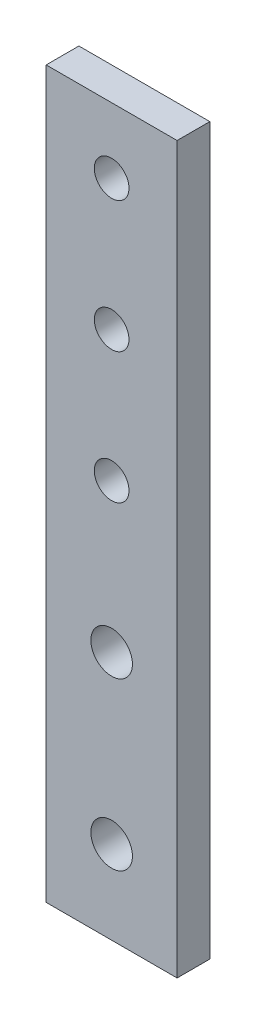
ISO-10303-21;
HEADER;
FILE_DESCRIPTION(('STEP AP214'),'2;1');
FILE_NAME('part.step','',(''),(''),'','','');
FILE_SCHEMA(('AUTOMOTIVE_DESIGN { 1 0 10303 214 1 1 1 1 }'));
ENDSEC;
DATA;
#1=APPLICATION_CONTEXT('core data for automotive mechanical design processes');
#2=APPLICATION_PROTOCOL_DEFINITION('international standard','automotive_design',2000,#1);
#3=PRODUCT_CONTEXT('',#1,'mechanical');
#4=PRODUCT('Part','Part','',(#3));
#5=PRODUCT_RELATED_PRODUCT_CATEGORY('part','',(#4));
#6=PRODUCT_DEFINITION_FORMATION('','',#4);
#7=PRODUCT_DEFINITION_CONTEXT('part definition',#1,'design');
#8=PRODUCT_DEFINITION('design','',#6,#7);
#9=PRODUCT_DEFINITION_SHAPE('','',#8);
#10=(LENGTH_UNIT() NAMED_UNIT(*) SI_UNIT(.MILLI.,.METRE.));
#11=(NAMED_UNIT(*) PLANE_ANGLE_UNIT() SI_UNIT($,.RADIAN.));
#12=(NAMED_UNIT(*) SI_UNIT($,.STERADIAN.) SOLID_ANGLE_UNIT());
#13=UNCERTAINTY_MEASURE_WITH_UNIT(LENGTH_MEASURE(1.E-05),#10,'distance_accuracy_value','');
#14=(GEOMETRIC_REPRESENTATION_CONTEXT(3) GLOBAL_UNCERTAINTY_ASSIGNED_CONTEXT((#13)) GLOBAL_UNIT_ASSIGNED_CONTEXT((#10,
#11,#12)) REPRESENTATION_CONTEXT('',''));
#15=CARTESIAN_POINT('',(0.,0.,0.));
#16=DIRECTION('',(0.,0.,1.));
#17=DIRECTION('',(1.,0.,0.));
#18=AXIS2_PLACEMENT_3D('',#15,#16,#17);
#19=CARTESIAN_POINT('',(-3.48017621145376,75.8330396475771,5.));
#20=DIRECTION('',(1.,0.,0.));
#21=DIRECTION('',(0.,1.,0.));
#22=AXIS2_PLACEMENT_3D('',#19,#20,#21);
#23=PLANE('',#22);
#24=DIRECTION('',(0.,-1.,0.));
#25=VECTOR('',#24,1.);
#26=CARTESIAN_POINT('',(-3.48017621145376,75.8330396475771,0.));
#27=LINE('',#26,#25);
#28=CARTESIAN_POINT('',(-3.48017621145376,75.8330396475771,0.));
#29=VERTEX_POINT('',#28);
#30=CARTESIAN_POINT('',(-3.48017621145374,-34.9669603524229,0.));
#31=VERTEX_POINT('',#30);
#32=EDGE_CURVE('E96',#29,#31,#27,.T.);
#33=ORIENTED_EDGE('',*,*,#32,.T.);
#34=DIRECTION('',(0.,0.,-1.));
#35=VECTOR('',#34,1.);
#36=CARTESIAN_POINT('',(-3.48017621145374,-34.9669603524229,5.));
#37=LINE('',#36,#35);
#38=CARTESIAN_POINT('',(-3.48017621145374,-34.9669603524229,5.));
#39=VERTEX_POINT('',#38);
#40=EDGE_CURVE('E11',#39,#31,#37,.T.);
#41=ORIENTED_EDGE('',*,*,#40,.F.);
#42=DIRECTION('',(0.,-1.,0.));
#43=VECTOR('',#42,1.);
#44=CARTESIAN_POINT('',(-3.48017621145376,75.8330396475771,5.));
#45=LINE('',#44,#43);
#46=CARTESIAN_POINT('',(-3.48017621145376,75.8330396475771,5.));
#47=VERTEX_POINT('',#46);
#48=EDGE_CURVE('E84',#47,#39,#45,.T.);
#49=ORIENTED_EDGE('',*,*,#48,.F.);
#50=DIRECTION('',(0.,0.,-1.));
#51=VECTOR('',#50,1.);
#52=CARTESIAN_POINT('',(-3.48017621145376,75.8330396475771,5.));
#53=LINE('',#52,#51);
#54=EDGE_CURVE('E92',#47,#29,#53,.T.);
#55=ORIENTED_EDGE('',*,*,#54,.T.);
#56=EDGE_LOOP('',(#33,#41,#49,#55));
#57=FACE_BOUND('',#56,.T.);
#58=ADVANCED_FACE('F33',(#57),#23,.F.);
#59=CARTESIAN_POINT('',(-3.48017621145374,-34.9669603524229,5.));
#60=DIRECTION('',(0.,1.,0.));
#61=DIRECTION('',(0.,0.,1.));
#62=AXIS2_PLACEMENT_3D('',#59,#60,#61);
#63=PLANE('',#62);
#64=DIRECTION('',(1.,0.,0.));
#65=VECTOR('',#64,1.);
#66=CARTESIAN_POINT('',(-3.48017621145374,-34.9669603524229,0.));
#67=LINE('',#66,#65);
#68=CARTESIAN_POINT('',(16.5198237885463,-34.9669603524229,0.));
#69=VERTEX_POINT('',#68);
#70=EDGE_CURVE('E88',#31,#69,#67,.T.);
#71=ORIENTED_EDGE('',*,*,#70,.T.);
#72=DIRECTION('',(0.,0.,-1.));
#73=VECTOR('',#72,1.);
#74=CARTESIAN_POINT('',(16.5198237885463,-34.9669603524229,5.));
#75=LINE('',#74,#73);
#76=CARTESIAN_POINT('',(16.5198237885463,-34.9669603524229,5.));
#77=VERTEX_POINT('',#76);
#78=EDGE_CURVE('E41',#77,#69,#75,.T.);
#79=ORIENTED_EDGE('',*,*,#78,.F.);
#80=DIRECTION('',(1.,0.,0.));
#81=VECTOR('',#80,1.);
#82=CARTESIAN_POINT('',(-3.48017621145374,-34.9669603524229,5.));
#83=LINE('',#82,#81);
#84=EDGE_CURVE('E79',#39,#77,#83,.T.);
#85=ORIENTED_EDGE('',*,*,#84,.F.);
#86=ORIENTED_EDGE('',*,*,#40,.T.);
#87=EDGE_LOOP('',(#71,#79,#85,#86));
#88=FACE_BOUND('',#87,.T.);
#89=ADVANCED_FACE('F87',(#88),#63,.F.);
#90=CARTESIAN_POINT('',(16.5198237885462,75.8330396475771,5.));
#91=DIRECTION('',(-1.,0.,0.));
#92=DIRECTION('',(0.,-1.,0.));
#93=AXIS2_PLACEMENT_3D('',#90,#91,#92);
#94=PLANE('',#93);
#95=DIRECTION('',(0.,1.,0.));
#96=VECTOR('',#95,1.);
#97=CARTESIAN_POINT('',(16.5198237885462,75.8330396475771,0.));
#98=LINE('',#97,#96);
#99=CARTESIAN_POINT('',(16.5198237885462,75.8330396475771,0.));
#100=VERTEX_POINT('',#99);
#101=EDGE_CURVE('E66',#69,#100,#98,.T.);
#102=ORIENTED_EDGE('',*,*,#101,.T.);
#103=DIRECTION('',(0.,0.,-1.));
#104=VECTOR('',#103,1.);
#105=CARTESIAN_POINT('',(16.5198237885462,75.8330396475771,5.));
#106=LINE('',#105,#104);
#107=CARTESIAN_POINT('',(16.5198237885462,75.8330396475771,5.));
#108=VERTEX_POINT('',#107);
#109=EDGE_CURVE('E89',#108,#100,#106,.T.);
#110=ORIENTED_EDGE('',*,*,#109,.F.);
#111=DIRECTION('',(0.,1.,0.));
#112=VECTOR('',#111,1.);
#113=CARTESIAN_POINT('',(16.5198237885462,75.8330396475771,5.));
#114=LINE('',#113,#112);
#115=EDGE_CURVE('E82',#77,#108,#114,.T.);
#116=ORIENTED_EDGE('',*,*,#115,.F.);
#117=ORIENTED_EDGE('',*,*,#78,.T.);
#118=EDGE_LOOP('',(#102,#110,#116,#117));
#119=FACE_BOUND('',#118,.T.);
#120=ADVANCED_FACE('F90',(#119),#94,.F.);
#121=CARTESIAN_POINT('',(-3.48017621145376,75.8330396475771,5.));
#122=DIRECTION('',(0.,-1.,0.));
#123=DIRECTION('',(0.,0.,-1.));
#124=AXIS2_PLACEMENT_3D('',#121,#122,#123);
#125=PLANE('',#124);
#126=DIRECTION('',(-1.,0.,0.));
#127=VECTOR('',#126,1.);
#128=CARTESIAN_POINT('',(-3.48017621145376,75.8330396475771,0.));
#129=LINE('',#128,#127);
#130=EDGE_CURVE('E72',#100,#29,#129,.T.);
#131=ORIENTED_EDGE('',*,*,#130,.T.);
#132=ORIENTED_EDGE('',*,*,#54,.F.);
#133=DIRECTION('',(-1.,0.,0.));
#134=VECTOR('',#133,1.);
#135=CARTESIAN_POINT('',(-3.48017621145376,75.8330396475771,5.));
#136=LINE('',#135,#134);
#137=EDGE_CURVE('E49',#108,#47,#136,.T.);
#138=ORIENTED_EDGE('',*,*,#137,.F.);
#139=ORIENTED_EDGE('',*,*,#109,.T.);
#140=EDGE_LOOP('',(#131,#132,#138,#139));
#141=FACE_BOUND('',#140,.T.);
#142=ADVANCED_FACE('F104',(#141),#125,.F.);
#143=CARTESIAN_POINT('',(0.,0.,5.));
#144=DIRECTION('',(0.,0.,1.));
#145=DIRECTION('',(1.,0.,0.));
#146=AXIS2_PLACEMENT_3D('',#143,#144,#145);
#147=PLANE('',#146);
#148=CARTESIAN_POINT('',(6.51982378854626,3.13303964757708,5.));
#149=DIRECTION('',(0.,0.,1.));
#150=DIRECTION('',(1.,0.,0.));
#151=AXIS2_PLACEMENT_3D('',#148,#149,#150);
#152=CIRCLE('',#151,3.175);
#153=CARTESIAN_POINT('',(9.69482378854625,3.13303964757708,5.));
#154=VERTEX_POINT('',#153);
#155=EDGE_CURVE('E136',#154,#154,#152,.T.);
#156=ORIENTED_EDGE('',*,*,#155,.F.);
#157=EDGE_LOOP('',(#156));
#158=FACE_BOUND('',#157,.T.);
#159=CARTESIAN_POINT('',(6.51982378854626,-22.2669603524229,5.));
#160=DIRECTION('',(0.,0.,1.));
#161=DIRECTION('',(1.,0.,0.));
#162=AXIS2_PLACEMENT_3D('',#159,#160,#161);
#163=CIRCLE('',#162,3.175);
#164=CARTESIAN_POINT('',(9.69482378854625,-22.2669603524229,5.));
#165=VERTEX_POINT('',#164);
#166=EDGE_CURVE('E130',#165,#165,#163,.T.);
#167=ORIENTED_EDGE('',*,*,#166,.F.);
#168=EDGE_LOOP('',(#167));
#169=FACE_BOUND('',#168,.T.);
#170=CARTESIAN_POINT('',(6.51982378854624,65.8330396475771,5.));
#171=DIRECTION('',(0.,0.,1.));
#172=DIRECTION('',(1.,0.,0.));
#173=AXIS2_PLACEMENT_3D('',#170,#171,#172);
#174=CIRCLE('',#173,2.65);
#175=CARTESIAN_POINT('',(9.16982378854624,65.8330396475771,5.));
#176=VERTEX_POINT('',#175);
#177=EDGE_CURVE('E124',#176,#176,#174,.T.);
#178=ORIENTED_EDGE('',*,*,#177,.F.);
#179=EDGE_LOOP('',(#178));
#180=FACE_BOUND('',#179,.T.);
#181=CARTESIAN_POINT('',(6.51982378854625,45.8330396475771,5.));
#182=DIRECTION('',(0.,0.,1.));
#183=DIRECTION('',(1.,0.,0.));
#184=AXIS2_PLACEMENT_3D('',#181,#182,#183);
#185=CIRCLE('',#184,2.65);
#186=CARTESIAN_POINT('',(9.16982378854625,45.8330396475771,5.));
#187=VERTEX_POINT('',#186);
#188=EDGE_CURVE('E118',#187,#187,#185,.T.);
#189=ORIENTED_EDGE('',*,*,#188,.F.);
#190=EDGE_LOOP('',(#189));
#191=FACE_BOUND('',#190,.T.);
#192=CARTESIAN_POINT('',(6.51982378854625,25.8330396475771,5.));
#193=DIRECTION('',(0.,0.,1.));
#194=DIRECTION('',(1.,0.,0.));
#195=AXIS2_PLACEMENT_3D('',#192,#193,#194);
#196=CIRCLE('',#195,2.65);
#197=CARTESIAN_POINT('',(9.16982378854625,25.8330396475771,5.));
#198=VERTEX_POINT('',#197);
#199=EDGE_CURVE('E112',#198,#198,#196,.T.);
#200=ORIENTED_EDGE('',*,*,#199,.F.);
#201=EDGE_LOOP('',(#200));
#202=FACE_BOUND('',#201,.T.);
#203=ORIENTED_EDGE('',*,*,#48,.T.);
#204=ORIENTED_EDGE('',*,*,#84,.T.);
#205=ORIENTED_EDGE('',*,*,#115,.T.);
#206=ORIENTED_EDGE('',*,*,#137,.T.);
#207=EDGE_LOOP('',(#203,#204,#205,#206));
#208=FACE_BOUND('',#207,.T.);
#209=ADVANCED_FACE('F80',(#158,#169,#180,#191,#202,#208),#147,.T.);
#210=CARTESIAN_POINT('',(0.,0.,0.));
#211=DIRECTION('',(0.,0.,1.));
#212=DIRECTION('',(1.,0.,0.));
#213=AXIS2_PLACEMENT_3D('',#210,#211,#212);
#214=PLANE('',#213);
#215=CARTESIAN_POINT('',(6.51982378854626,3.13303964757708,0.));
#216=DIRECTION('',(0.,0.,1.));
#217=DIRECTION('',(1.,0.,0.));
#218=AXIS2_PLACEMENT_3D('',#215,#216,#217);
#219=CIRCLE('',#218,3.175);
#220=CARTESIAN_POINT('',(9.69482378854625,3.13303964757708,0.));
#221=VERTEX_POINT('',#220);
#222=EDGE_CURVE('E133',#221,#221,#219,.T.);
#223=ORIENTED_EDGE('',*,*,#222,.T.);
#224=EDGE_LOOP('',(#223));
#225=FACE_BOUND('',#224,.T.);
#226=CARTESIAN_POINT('',(6.51982378854626,-22.2669603524229,0.));
#227=DIRECTION('',(0.,0.,1.));
#228=DIRECTION('',(1.,0.,0.));
#229=AXIS2_PLACEMENT_3D('',#226,#227,#228);
#230=CIRCLE('',#229,3.175);
#231=CARTESIAN_POINT('',(9.69482378854625,-22.2669603524229,0.));
#232=VERTEX_POINT('',#231);
#233=EDGE_CURVE('E127',#232,#232,#230,.T.);
#234=ORIENTED_EDGE('',*,*,#233,.T.);
#235=EDGE_LOOP('',(#234));
#236=FACE_BOUND('',#235,.T.);
#237=CARTESIAN_POINT('',(6.51982378854624,65.8330396475771,0.));
#238=DIRECTION('',(0.,0.,1.));
#239=DIRECTION('',(1.,0.,0.));
#240=AXIS2_PLACEMENT_3D('',#237,#238,#239);
#241=CIRCLE('',#240,2.65);
#242=CARTESIAN_POINT('',(9.16982378854624,65.8330396475771,0.));
#243=VERTEX_POINT('',#242);
#244=EDGE_CURVE('E121',#243,#243,#241,.T.);
#245=ORIENTED_EDGE('',*,*,#244,.T.);
#246=EDGE_LOOP('',(#245));
#247=FACE_BOUND('',#246,.T.);
#248=CARTESIAN_POINT('',(6.51982378854625,45.8330396475771,0.));
#249=DIRECTION('',(0.,0.,1.));
#250=DIRECTION('',(1.,0.,0.));
#251=AXIS2_PLACEMENT_3D('',#248,#249,#250);
#252=CIRCLE('',#251,2.65);
#253=CARTESIAN_POINT('',(9.16982378854625,45.8330396475771,0.));
#254=VERTEX_POINT('',#253);
#255=EDGE_CURVE('E115',#254,#254,#252,.T.);
#256=ORIENTED_EDGE('',*,*,#255,.T.);
#257=EDGE_LOOP('',(#256));
#258=FACE_BOUND('',#257,.T.);
#259=CARTESIAN_POINT('',(6.51982378854625,25.8330396475771,0.));
#260=DIRECTION('',(0.,0.,1.));
#261=DIRECTION('',(1.,0.,0.));
#262=AXIS2_PLACEMENT_3D('',#259,#260,#261);
#263=CIRCLE('',#262,2.65);
#264=CARTESIAN_POINT('',(9.16982378854625,25.8330396475771,0.));
#265=VERTEX_POINT('',#264);
#266=EDGE_CURVE('E99',#265,#265,#263,.T.);
#267=ORIENTED_EDGE('',*,*,#266,.T.);
#268=EDGE_LOOP('',(#267));
#269=FACE_BOUND('',#268,.T.);
#270=ORIENTED_EDGE('',*,*,#32,.F.);
#271=ORIENTED_EDGE('',*,*,#130,.F.);
#272=ORIENTED_EDGE('',*,*,#101,.F.);
#273=ORIENTED_EDGE('',*,*,#70,.F.);
#274=EDGE_LOOP('',(#270,#271,#272,#273));
#275=FACE_BOUND('',#274,.T.);
#276=ADVANCED_FACE('F107',(#225,#236,#247,#258,#269,#275),#214,.F.);
#277=CARTESIAN_POINT('',(6.51982378854625,25.8330396475771,5.));
#278=DIRECTION('',(0.,0.,1.));
#279=DIRECTION('',(1.,0.,0.));
#280=AXIS2_PLACEMENT_3D('',#277,#278,#279);
#281=CYLINDRICAL_SURFACE('',#280,2.65);
#282=ORIENTED_EDGE('',*,*,#266,.F.);
#283=EDGE_LOOP('',(#282));
#284=FACE_BOUND('',#283,.T.);
#285=ORIENTED_EDGE('',*,*,#199,.T.);
#286=EDGE_LOOP('',(#285));
#287=FACE_BOUND('',#286,.T.);
#288=ADVANCED_FACE('F153',(#284,#287),#281,.F.);
#289=CARTESIAN_POINT('',(6.51982378854625,45.8330396475771,5.));
#290=DIRECTION('',(0.,0.,1.));
#291=DIRECTION('',(1.,0.,0.));
#292=AXIS2_PLACEMENT_3D('',#289,#290,#291);
#293=CYLINDRICAL_SURFACE('',#292,2.65);
#294=ORIENTED_EDGE('',*,*,#255,.F.);
#295=EDGE_LOOP('',(#294));
#296=FACE_BOUND('',#295,.T.);
#297=ORIENTED_EDGE('',*,*,#188,.T.);
#298=EDGE_LOOP('',(#297));
#299=FACE_BOUND('',#298,.T.);
#300=ADVANCED_FACE('F155',(#296,#299),#293,.F.);
#301=CARTESIAN_POINT('',(6.51982378854624,65.8330396475771,5.));
#302=DIRECTION('',(0.,0.,1.));
#303=DIRECTION('',(1.,0.,0.));
#304=AXIS2_PLACEMENT_3D('',#301,#302,#303);
#305=CYLINDRICAL_SURFACE('',#304,2.65);
#306=ORIENTED_EDGE('',*,*,#244,.F.);
#307=EDGE_LOOP('',(#306));
#308=FACE_BOUND('',#307,.T.);
#309=ORIENTED_EDGE('',*,*,#177,.T.);
#310=EDGE_LOOP('',(#309));
#311=FACE_BOUND('',#310,.T.);
#312=ADVANCED_FACE('F162',(#308,#311),#305,.F.);
#313=CARTESIAN_POINT('',(6.51982378854626,-22.2669603524229,5.));
#314=DIRECTION('',(0.,0.,1.));
#315=DIRECTION('',(1.,0.,0.));
#316=AXIS2_PLACEMENT_3D('',#313,#314,#315);
#317=CYLINDRICAL_SURFACE('',#316,3.175);
#318=ORIENTED_EDGE('',*,*,#233,.F.);
#319=EDGE_LOOP('',(#318));
#320=FACE_BOUND('',#319,.T.);
#321=ORIENTED_EDGE('',*,*,#166,.T.);
#322=EDGE_LOOP('',(#321));
#323=FACE_BOUND('',#322,.T.);
#324=ADVANCED_FACE('F197',(#320,#323),#317,.F.);
#325=CARTESIAN_POINT('',(6.51982378854626,3.13303964757708,5.));
#326=DIRECTION('',(0.,0.,1.));
#327=DIRECTION('',(1.,0.,0.));
#328=AXIS2_PLACEMENT_3D('',#325,#326,#327);
#329=CYLINDRICAL_SURFACE('',#328,3.175);
#330=ORIENTED_EDGE('',*,*,#222,.F.);
#331=EDGE_LOOP('',(#330));
#332=FACE_BOUND('',#331,.T.);
#333=ORIENTED_EDGE('',*,*,#155,.T.);
#334=EDGE_LOOP('',(#333));
#335=FACE_BOUND('',#334,.T.);
#336=ADVANCED_FACE('F140',(#332,#335),#329,.F.);
#337=CLOSED_SHELL('',(#58,#89,#120,#142,#209,#276,#288,#300,#312,#324,#336));
#338=MANIFOLD_SOLID_BREP('B2',#337);
#339=ADVANCED_BREP_SHAPE_REPRESENTATION('',(#18,#338),#14);
#340=SHAPE_DEFINITION_REPRESENTATION(#9,#339);
ENDSEC;
END-ISO-10303-21;
